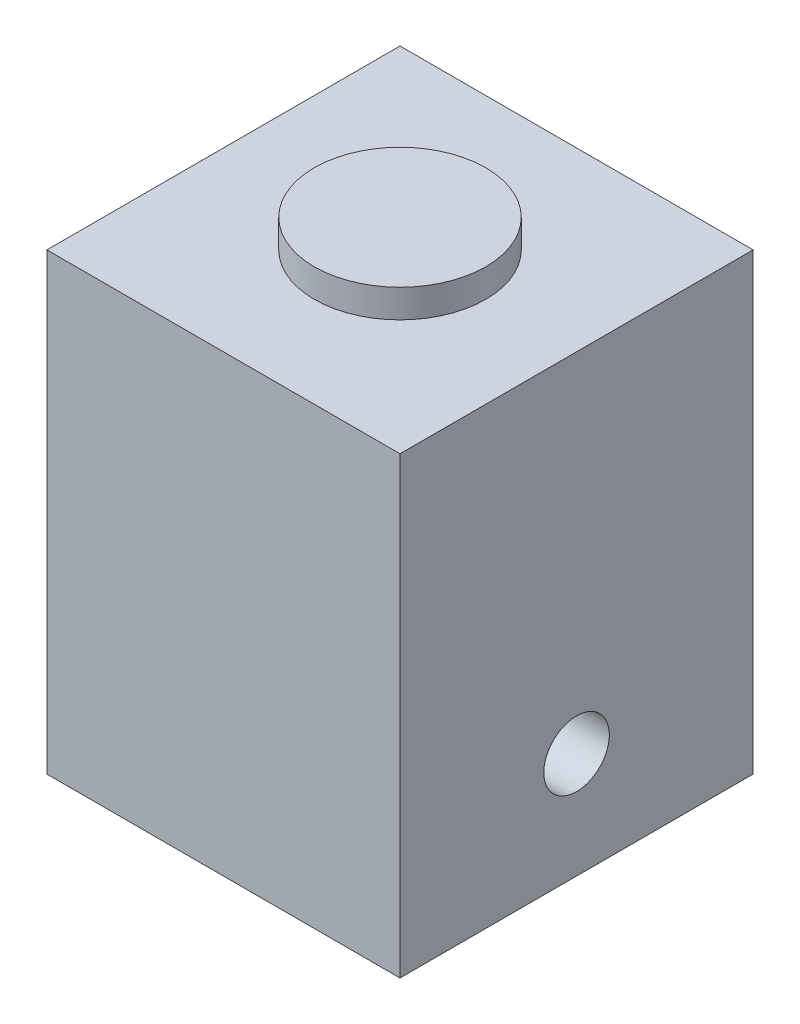
ISO-10303-21;
HEADER;
FILE_DESCRIPTION(('STEP AP214'),'2;1');
FILE_NAME('part.step','',(''),(''),'','','');
FILE_SCHEMA(('AUTOMOTIVE_DESIGN { 1 0 10303 214 1 1 1 1 }'));
ENDSEC;
DATA;
#1=APPLICATION_CONTEXT('core data for automotive mechanical design processes');
#2=APPLICATION_PROTOCOL_DEFINITION('international standard','automotive_design',2000,#1);
#3=PRODUCT_CONTEXT('',#1,'mechanical');
#4=PRODUCT('Part','Part','',(#3));
#5=PRODUCT_RELATED_PRODUCT_CATEGORY('part','',(#4));
#6=PRODUCT_DEFINITION_FORMATION('','',#4);
#7=PRODUCT_DEFINITION_CONTEXT('part definition',#1,'design');
#8=PRODUCT_DEFINITION('design','',#6,#7);
#9=PRODUCT_DEFINITION_SHAPE('','',#8);
#10=(LENGTH_UNIT() NAMED_UNIT(*) SI_UNIT(.MILLI.,.METRE.));
#11=(NAMED_UNIT(*) PLANE_ANGLE_UNIT() SI_UNIT($,.RADIAN.));
#12=(NAMED_UNIT(*) SI_UNIT($,.STERADIAN.) SOLID_ANGLE_UNIT());
#13=UNCERTAINTY_MEASURE_WITH_UNIT(LENGTH_MEASURE(1.E-05),#10,'distance_accuracy_value','');
#14=(GEOMETRIC_REPRESENTATION_CONTEXT(3) GLOBAL_UNCERTAINTY_ASSIGNED_CONTEXT((#13)) GLOBAL_UNIT_ASSIGNED_CONTEXT((#10,
#11,#12)) REPRESENTATION_CONTEXT('',''));
#15=CARTESIAN_POINT('',(0.,0.,0.));
#16=DIRECTION('',(0.,0.,1.));
#17=DIRECTION('',(1.,0.,0.));
#18=AXIS2_PLACEMENT_3D('',#15,#16,#17);
#19=CARTESIAN_POINT('',(17.5,45.,-17.5));
#20=DIRECTION('',(-1.,0.,0.));
#21=DIRECTION('',(0.,0.,1.));
#22=AXIS2_PLACEMENT_3D('',#19,#20,#21);
#23=PLANE('',#22);
#24=CARTESIAN_POINT('',(17.5,10.5,0.));
#25=DIRECTION('',(1.,0.,0.));
#26=DIRECTION('',(0.,0.,-1.));
#27=AXIS2_PLACEMENT_3D('',#24,#25,#26);
#28=CIRCLE('',#27,3.25);
#29=CARTESIAN_POINT('',(17.5,10.5,-3.25));
#30=VERTEX_POINT('',#29);
#31=EDGE_CURVE('E207',#30,#30,#28,.T.);
#32=ORIENTED_EDGE('',*,*,#31,.F.);
#33=EDGE_LOOP('',(#32));
#34=FACE_BOUND('',#33,.T.);
#35=DIRECTION('',(0.,0.,-1.));
#36=VECTOR('',#35,1.);
#37=CARTESIAN_POINT('',(17.5,0.,-17.5));
#38=LINE('',#37,#36);
#39=CARTESIAN_POINT('',(17.5,0.,17.5));
#40=VERTEX_POINT('',#39);
#41=CARTESIAN_POINT('',(17.5,0.,-17.5));
#42=VERTEX_POINT('',#41);
#43=EDGE_CURVE('E152',#40,#42,#38,.T.);
#44=ORIENTED_EDGE('',*,*,#43,.T.);
#45=DIRECTION('',(0.,-1.,0.));
#46=VECTOR('',#45,1.);
#47=CARTESIAN_POINT('',(17.5,45.,-17.5));
#48=LINE('',#47,#46);
#49=CARTESIAN_POINT('',(17.5,45.,-17.5));
#50=VERTEX_POINT('',#49);
#51=EDGE_CURVE('E41',#50,#42,#48,.T.);
#52=ORIENTED_EDGE('',*,*,#51,.F.);
#53=DIRECTION('',(0.,0.,-1.));
#54=VECTOR('',#53,1.);
#55=CARTESIAN_POINT('',(17.5,45.,-17.5));
#56=LINE('',#55,#54);
#57=CARTESIAN_POINT('',(17.5,45.,17.5));
#58=VERTEX_POINT('',#57);
#59=EDGE_CURVE('E154',#58,#50,#56,.T.);
#60=ORIENTED_EDGE('',*,*,#59,.F.);
#61=DIRECTION('',(0.,-1.,0.));
#62=VECTOR('',#61,1.);
#63=CARTESIAN_POINT('',(17.5,45.,17.5));
#64=LINE('',#63,#62);
#65=EDGE_CURVE('E160',#58,#40,#64,.T.);
#66=ORIENTED_EDGE('',*,*,#65,.T.);
#67=EDGE_LOOP('',(#44,#52,#60,#66));
#68=FACE_BOUND('',#67,.T.);
#69=ADVANCED_FACE('F33',(#34,#68),#23,.F.);
#70=CARTESIAN_POINT('',(-17.5,45.,-17.5));
#71=DIRECTION('',(0.,0.,1.));
#72=DIRECTION('',(1.,0.,0.));
#73=AXIS2_PLACEMENT_3D('',#70,#71,#72);
#74=PLANE('',#73);
#75=DIRECTION('',(-1.,0.,0.));
#76=VECTOR('',#75,1.);
#77=CARTESIAN_POINT('',(-17.5,0.,-17.5));
#78=LINE('',#77,#76);
#79=CARTESIAN_POINT('',(-17.5,0.,-17.5));
#80=VERTEX_POINT('',#79);
#81=EDGE_CURVE('E163',#42,#80,#78,.T.);
#82=ORIENTED_EDGE('',*,*,#81,.T.);
#83=DIRECTION('',(0.,-1.,0.));
#84=VECTOR('',#83,1.);
#85=CARTESIAN_POINT('',(-17.5,45.,-17.5));
#86=LINE('',#85,#84);
#87=CARTESIAN_POINT('',(-17.5,45.,-17.5));
#88=VERTEX_POINT('',#87);
#89=EDGE_CURVE('E171',#88,#80,#86,.T.);
#90=ORIENTED_EDGE('',*,*,#89,.F.);
#91=DIRECTION('',(-1.,0.,0.));
#92=VECTOR('',#91,1.);
#93=CARTESIAN_POINT('',(-17.5,45.,-17.5));
#94=LINE('',#93,#92);
#95=EDGE_CURVE('E87',#50,#88,#94,.T.);
#96=ORIENTED_EDGE('',*,*,#95,.F.);
#97=ORIENTED_EDGE('',*,*,#51,.T.);
#98=EDGE_LOOP('',(#82,#90,#96,#97));
#99=FACE_BOUND('',#98,.T.);
#100=ADVANCED_FACE('F174',(#99),#74,.F.);
#101=CARTESIAN_POINT('',(-17.5,45.,-17.5));
#102=DIRECTION('',(1.,0.,0.));
#103=DIRECTION('',(0.,0.,-1.));
#104=AXIS2_PLACEMENT_3D('',#101,#102,#103);
#105=PLANE('',#104);
#106=CARTESIAN_POINT('',(-17.5,10.5,0.));
#107=DIRECTION('',(1.,0.,0.));
#108=DIRECTION('',(0.,0.,-1.));
#109=AXIS2_PLACEMENT_3D('',#106,#107,#108);
#110=CIRCLE('',#109,3.25);
#111=CARTESIAN_POINT('',(-17.5,10.5,-3.25));
#112=VERTEX_POINT('',#111);
#113=EDGE_CURVE('E209',#112,#112,#110,.T.);
#114=ORIENTED_EDGE('',*,*,#113,.T.);
#115=EDGE_LOOP('',(#114));
#116=FACE_BOUND('',#115,.T.);
#117=DIRECTION('',(0.,0.,1.));
#118=VECTOR('',#117,1.);
#119=CARTESIAN_POINT('',(-17.5,0.,-17.5));
#120=LINE('',#119,#118);
#121=CARTESIAN_POINT('',(-17.5,0.,17.5));
#122=VERTEX_POINT('',#121);
#123=EDGE_CURVE('E165',#80,#122,#120,.T.);
#124=ORIENTED_EDGE('',*,*,#123,.T.);
#125=DIRECTION('',(0.,-1.,0.));
#126=VECTOR('',#125,1.);
#127=CARTESIAN_POINT('',(-17.5,45.,17.5));
#128=LINE('',#127,#126);
#129=CARTESIAN_POINT('',(-17.5,45.,17.5));
#130=VERTEX_POINT('',#129);
#131=EDGE_CURVE('E169',#130,#122,#128,.T.);
#132=ORIENTED_EDGE('',*,*,#131,.F.);
#133=DIRECTION('',(0.,0.,1.));
#134=VECTOR('',#133,1.);
#135=CARTESIAN_POINT('',(-17.5,45.,-17.5));
#136=LINE('',#135,#134);
#137=EDGE_CURVE('E157',#88,#130,#136,.T.);
#138=ORIENTED_EDGE('',*,*,#137,.F.);
#139=ORIENTED_EDGE('',*,*,#89,.T.);
#140=EDGE_LOOP('',(#124,#132,#138,#139));
#141=FACE_BOUND('',#140,.T.);
#142=ADVANCED_FACE('F183',(#116,#141),#105,.F.);
#143=CARTESIAN_POINT('',(-17.5,45.,17.5));
#144=DIRECTION('',(0.,0.,-1.));
#145=DIRECTION('',(-1.,0.,0.));
#146=AXIS2_PLACEMENT_3D('',#143,#144,#145);
#147=PLANE('',#146);
#148=DIRECTION('',(1.,0.,0.));
#149=VECTOR('',#148,1.);
#150=CARTESIAN_POINT('',(-17.5,0.,17.5));
#151=LINE('',#150,#149);
#152=EDGE_CURVE('E79',#122,#40,#151,.T.);
#153=ORIENTED_EDGE('',*,*,#152,.T.);
#154=ORIENTED_EDGE('',*,*,#65,.F.);
#155=DIRECTION('',(1.,0.,0.));
#156=VECTOR('',#155,1.);
#157=CARTESIAN_POINT('',(-17.5,45.,17.5));
#158=LINE('',#157,#156);
#159=EDGE_CURVE('E58',#130,#58,#158,.T.);
#160=ORIENTED_EDGE('',*,*,#159,.F.);
#161=ORIENTED_EDGE('',*,*,#131,.T.);
#162=EDGE_LOOP('',(#153,#154,#160,#161));
#163=FACE_BOUND('',#162,.T.);
#164=ADVANCED_FACE('F185',(#163),#147,.F.);
#165=CARTESIAN_POINT('',(0.,45.,0.));
#166=DIRECTION('',(0.,1.,0.));
#167=DIRECTION('',(0.,0.,1.));
#168=AXIS2_PLACEMENT_3D('',#165,#166,#167);
#169=PLANE('',#168);
#170=CARTESIAN_POINT('',(0.,45.,0.));
#171=DIRECTION('',(0.,1.,0.));
#172=DIRECTION('',(0.,0.,1.));
#173=AXIS2_PLACEMENT_3D('',#170,#171,#172);
#174=CIRCLE('',#173,8.5);
#175=CARTESIAN_POINT('',(0.,45.,8.5));
#176=VERTEX_POINT('',#175);
#177=EDGE_CURVE('E11',#176,#176,#174,.T.);
#178=ORIENTED_EDGE('',*,*,#177,.F.);
#179=EDGE_LOOP('',(#178));
#180=FACE_BOUND('',#179,.T.);
#181=ORIENTED_EDGE('',*,*,#59,.T.);
#182=ORIENTED_EDGE('',*,*,#95,.T.);
#183=ORIENTED_EDGE('',*,*,#137,.T.);
#184=ORIENTED_EDGE('',*,*,#159,.T.);
#185=EDGE_LOOP('',(#181,#182,#183,#184));
#186=FACE_BOUND('',#185,.T.);
#187=ADVANCED_FACE('F186',(#180,#186),#169,.T.);
#188=CARTESIAN_POINT('',(0.,0.,0.));
#189=DIRECTION('',(0.,1.,0.));
#190=DIRECTION('',(0.,0.,1.));
#191=AXIS2_PLACEMENT_3D('',#188,#189,#190);
#192=PLANE('',#191);
#193=DIRECTION('',(-1.,0.,0.));
#194=VECTOR('',#193,1.);
#195=CARTESIAN_POINT('',(-12.,0.,12.));
#196=LINE('',#195,#194);
#197=CARTESIAN_POINT('',(12.,0.,12.));
#198=VERTEX_POINT('',#197);
#199=CARTESIAN_POINT('',(-12.,0.,12.));
#200=VERTEX_POINT('',#199);
#201=EDGE_CURVE('E141',#198,#200,#196,.T.);
#202=ORIENTED_EDGE('',*,*,#201,.F.);
#203=DIRECTION('',(0.,0.,1.));
#204=VECTOR('',#203,1.);
#205=CARTESIAN_POINT('',(12.,0.,12.));
#206=LINE('',#205,#204);
#207=CARTESIAN_POINT('',(12.,0.,-12.));
#208=VERTEX_POINT('',#207);
#209=EDGE_CURVE('E49',#208,#198,#206,.T.);
#210=ORIENTED_EDGE('',*,*,#209,.F.);
#211=DIRECTION('',(1.,0.,0.));
#212=VECTOR('',#211,1.);
#213=CARTESIAN_POINT('',(-12.,0.,-12.));
#214=LINE('',#213,#212);
#215=CARTESIAN_POINT('',(-12.,0.,-12.));
#216=VERTEX_POINT('',#215);
#217=EDGE_CURVE('E129',#216,#208,#214,.T.);
#218=ORIENTED_EDGE('',*,*,#217,.F.);
#219=DIRECTION('',(0.,0.,-1.));
#220=VECTOR('',#219,1.);
#221=CARTESIAN_POINT('',(-12.,0.,12.));
#222=LINE('',#221,#220);
#223=EDGE_CURVE('E132',#200,#216,#222,.T.);
#224=ORIENTED_EDGE('',*,*,#223,.F.);
#225=EDGE_LOOP('',(#202,#210,#218,#224));
#226=FACE_BOUND('',#225,.T.);
#227=ORIENTED_EDGE('',*,*,#43,.F.);
#228=ORIENTED_EDGE('',*,*,#152,.F.);
#229=ORIENTED_EDGE('',*,*,#123,.F.);
#230=ORIENTED_EDGE('',*,*,#81,.F.);
#231=EDGE_LOOP('',(#227,#228,#229,#230));
#232=FACE_BOUND('',#231,.T.);
#233=ADVANCED_FACE('F179',(#226,#232),#192,.F.);
#234=CARTESIAN_POINT('',(0.,47.8,0.));
#235=DIRECTION('',(0.,-1.,0.));
#236=DIRECTION('',(0.,0.,-1.));
#237=AXIS2_PLACEMENT_3D('',#234,#235,#236);
#238=CYLINDRICAL_SURFACE('',#237,8.5);
#239=CARTESIAN_POINT('',(0.,47.8,0.));
#240=DIRECTION('',(0.,1.,0.));
#241=DIRECTION('',(0.,0.,1.));
#242=AXIS2_PLACEMENT_3D('',#239,#240,#241);
#243=CIRCLE('',#242,8.5);
#244=CARTESIAN_POINT('',(0.,47.8,8.5));
#245=VERTEX_POINT('',#244);
#246=EDGE_CURVE('E147',#245,#245,#243,.T.);
#247=ORIENTED_EDGE('',*,*,#246,.F.);
#248=EDGE_LOOP('',(#247));
#249=FACE_BOUND('',#248,.T.);
#250=ORIENTED_EDGE('',*,*,#177,.T.);
#251=EDGE_LOOP('',(#250));
#252=FACE_BOUND('',#251,.T.);
#253=ADVANCED_FACE('F194',(#249,#252),#238,.T.);
#254=CARTESIAN_POINT('',(0.,47.8,0.));
#255=DIRECTION('',(0.,1.,0.));
#256=DIRECTION('',(0.,0.,1.));
#257=AXIS2_PLACEMENT_3D('',#254,#255,#256);
#258=PLANE('',#257);
#259=ORIENTED_EDGE('',*,*,#246,.T.);
#260=EDGE_LOOP('',(#259));
#261=FACE_BOUND('',#260,.T.);
#262=ADVANCED_FACE('F243',(#261),#258,.T.);
#263=CARTESIAN_POINT('',(12.,40.,12.));
#264=DIRECTION('',(1.,0.,0.));
#265=DIRECTION('',(0.,0.,-1.));
#266=AXIS2_PLACEMENT_3D('',#263,#264,#265);
#267=PLANE('',#266);
#268=CARTESIAN_POINT('',(12.,10.5,0.));
#269=DIRECTION('',(1.,0.,0.));
#270=DIRECTION('',(0.,0.,-1.));
#271=AXIS2_PLACEMENT_3D('',#268,#269,#270);
#272=CIRCLE('',#271,3.25);
#273=CARTESIAN_POINT('',(12.,10.5,-3.25));
#274=VERTEX_POINT('',#273);
#275=EDGE_CURVE('E135',#274,#274,#272,.T.);
#276=ORIENTED_EDGE('',*,*,#275,.T.);
#277=EDGE_LOOP('',(#276));
#278=FACE_BOUND('',#277,.T.);
#279=ORIENTED_EDGE('',*,*,#209,.T.);
#280=DIRECTION('',(0.,-1.,0.));
#281=VECTOR('',#280,1.);
#282=CARTESIAN_POINT('',(12.,40.,12.));
#283=LINE('',#282,#281);
#284=CARTESIAN_POINT('',(12.,40.,12.));
#285=VERTEX_POINT('',#284);
#286=EDGE_CURVE('E107',#285,#198,#283,.T.);
#287=ORIENTED_EDGE('',*,*,#286,.F.);
#288=DIRECTION('',(0.,0.,1.));
#289=VECTOR('',#288,1.);
#290=CARTESIAN_POINT('',(12.,40.,12.));
#291=LINE('',#290,#289);
#292=CARTESIAN_POINT('',(12.,40.,-12.));
#293=VERTEX_POINT('',#292);
#294=EDGE_CURVE('E111',#293,#285,#291,.T.);
#295=ORIENTED_EDGE('',*,*,#294,.F.);
#296=DIRECTION('',(0.,-1.,0.));
#297=VECTOR('',#296,1.);
#298=CARTESIAN_POINT('',(12.,40.,-12.));
#299=LINE('',#298,#297);
#300=EDGE_CURVE('E145',#293,#208,#299,.T.);
#301=ORIENTED_EDGE('',*,*,#300,.T.);
#302=EDGE_LOOP('',(#279,#287,#295,#301));
#303=FACE_BOUND('',#302,.T.);
#304=ADVANCED_FACE('F109',(#278,#303),#267,.F.);
#305=CARTESIAN_POINT('',(-12.,40.,-12.));
#306=DIRECTION('',(0.,0.,-1.));
#307=DIRECTION('',(-1.,0.,0.));
#308=AXIS2_PLACEMENT_3D('',#305,#306,#307);
#309=PLANE('',#308);
#310=ORIENTED_EDGE('',*,*,#217,.T.);
#311=ORIENTED_EDGE('',*,*,#300,.F.);
#312=DIRECTION('',(1.,0.,0.));
#313=VECTOR('',#312,1.);
#314=CARTESIAN_POINT('',(-12.,40.,-12.));
#315=LINE('',#314,#313);
#316=CARTESIAN_POINT('',(-12.,40.,-12.));
#317=VERTEX_POINT('',#316);
#318=EDGE_CURVE('E117',#317,#293,#315,.T.);
#319=ORIENTED_EDGE('',*,*,#318,.F.);
#320=DIRECTION('',(0.,-1.,0.));
#321=VECTOR('',#320,1.);
#322=CARTESIAN_POINT('',(-12.,40.,-12.));
#323=LINE('',#322,#321);
#324=EDGE_CURVE('E148',#317,#216,#323,.T.);
#325=ORIENTED_EDGE('',*,*,#324,.T.);
#326=EDGE_LOOP('',(#310,#311,#319,#325));
#327=FACE_BOUND('',#326,.T.);
#328=ADVANCED_FACE('F232',(#327),#309,.F.);
#329=CARTESIAN_POINT('',(-12.,40.,12.));
#330=DIRECTION('',(-1.,0.,0.));
#331=DIRECTION('',(0.,0.,1.));
#332=AXIS2_PLACEMENT_3D('',#329,#330,#331);
#333=PLANE('',#332);
#334=CARTESIAN_POINT('',(-12.,10.5,0.));
#335=DIRECTION('',(-1.,0.,0.));
#336=DIRECTION('',(0.,0.,1.));
#337=AXIS2_PLACEMENT_3D('',#334,#335,#336);
#338=CIRCLE('',#337,3.25);
#339=CARTESIAN_POINT('',(-12.,10.5,3.25));
#340=VERTEX_POINT('',#339);
#341=EDGE_CURVE('E36',#340,#340,#338,.T.);
#342=ORIENTED_EDGE('',*,*,#341,.T.);
#343=EDGE_LOOP('',(#342));
#344=FACE_BOUND('',#343,.T.);
#345=ORIENTED_EDGE('',*,*,#223,.T.);
#346=ORIENTED_EDGE('',*,*,#324,.F.);
#347=DIRECTION('',(0.,0.,-1.));
#348=VECTOR('',#347,1.);
#349=CARTESIAN_POINT('',(-12.,40.,12.));
#350=LINE('',#349,#348);
#351=CARTESIAN_POINT('',(-12.,40.,12.));
#352=VERTEX_POINT('',#351);
#353=EDGE_CURVE('E125',#352,#317,#350,.T.);
#354=ORIENTED_EDGE('',*,*,#353,.F.);
#355=DIRECTION('',(0.,-1.,0.));
#356=VECTOR('',#355,1.);
#357=CARTESIAN_POINT('',(-12.,40.,12.));
#358=LINE('',#357,#356);
#359=EDGE_CURVE('E116',#352,#200,#358,.T.);
#360=ORIENTED_EDGE('',*,*,#359,.T.);
#361=EDGE_LOOP('',(#345,#346,#354,#360));
#362=FACE_BOUND('',#361,.T.);
#363=ADVANCED_FACE('F235',(#344,#362),#333,.F.);
#364=CARTESIAN_POINT('',(-12.,40.,12.));
#365=DIRECTION('',(0.,0.,1.));
#366=DIRECTION('',(1.,0.,0.));
#367=AXIS2_PLACEMENT_3D('',#364,#365,#366);
#368=PLANE('',#367);
#369=ORIENTED_EDGE('',*,*,#201,.T.);
#370=ORIENTED_EDGE('',*,*,#359,.F.);
#371=DIRECTION('',(-1.,0.,0.));
#372=VECTOR('',#371,1.);
#373=CARTESIAN_POINT('',(-12.,40.,12.));
#374=LINE('',#373,#372);
#375=EDGE_CURVE('E120',#285,#352,#374,.T.);
#376=ORIENTED_EDGE('',*,*,#375,.F.);
#377=ORIENTED_EDGE('',*,*,#286,.T.);
#378=EDGE_LOOP('',(#369,#370,#376,#377));
#379=FACE_BOUND('',#378,.T.);
#380=ADVANCED_FACE('F121',(#379),#368,.F.);
#381=CARTESIAN_POINT('',(0.,40.,0.));
#382=DIRECTION('',(0.,-1.,0.));
#383=DIRECTION('',(0.,0.,-1.));
#384=AXIS2_PLACEMENT_3D('',#381,#382,#383);
#385=PLANE('',#384);
#386=ORIENTED_EDGE('',*,*,#294,.T.);
#387=ORIENTED_EDGE('',*,*,#375,.T.);
#388=ORIENTED_EDGE('',*,*,#353,.T.);
#389=ORIENTED_EDGE('',*,*,#318,.T.);
#390=EDGE_LOOP('',(#386,#387,#388,#389));
#391=FACE_BOUND('',#390,.T.);
#392=ADVANCED_FACE('F127',(#391),#385,.T.);
#393=CARTESIAN_POINT('',(-17.5,10.5,0.));
#394=DIRECTION('',(1.,0.,0.));
#395=DIRECTION('',(0.,0.,-1.));
#396=AXIS2_PLACEMENT_3D('',#393,#394,#395);
#397=CYLINDRICAL_SURFACE('',#396,3.25);
#398=ORIENTED_EDGE('',*,*,#113,.F.);
#399=EDGE_LOOP('',(#398));
#400=FACE_BOUND('',#399,.T.);
#401=ORIENTED_EDGE('',*,*,#341,.F.);
#402=EDGE_LOOP('',(#401));
#403=FACE_BOUND('',#402,.T.);
#404=ADVANCED_FACE('F223',(#400,#403),#397,.F.);
#405=ORIENTED_EDGE('',*,*,#31,.T.);
#406=EDGE_LOOP('',(#405));
#407=FACE_BOUND('',#406,.T.);
#408=ORIENTED_EDGE('',*,*,#275,.F.);
#409=EDGE_LOOP('',(#408));
#410=FACE_BOUND('',#409,.T.);
#411=ADVANCED_FACE('F221',(#407,#410),#397,.F.);
#412=CLOSED_SHELL('',(#69,#100,#142,#164,#187,#233,#253,#262,#304,#328,#363,#380,#392,#404,#411));
#413=MANIFOLD_SOLID_BREP('B2',#412);
#414=ADVANCED_BREP_SHAPE_REPRESENTATION('',(#18,#413),#14);
#415=SHAPE_DEFINITION_REPRESENTATION(#9,#414);
ENDSEC;
END-ISO-10303-21;
